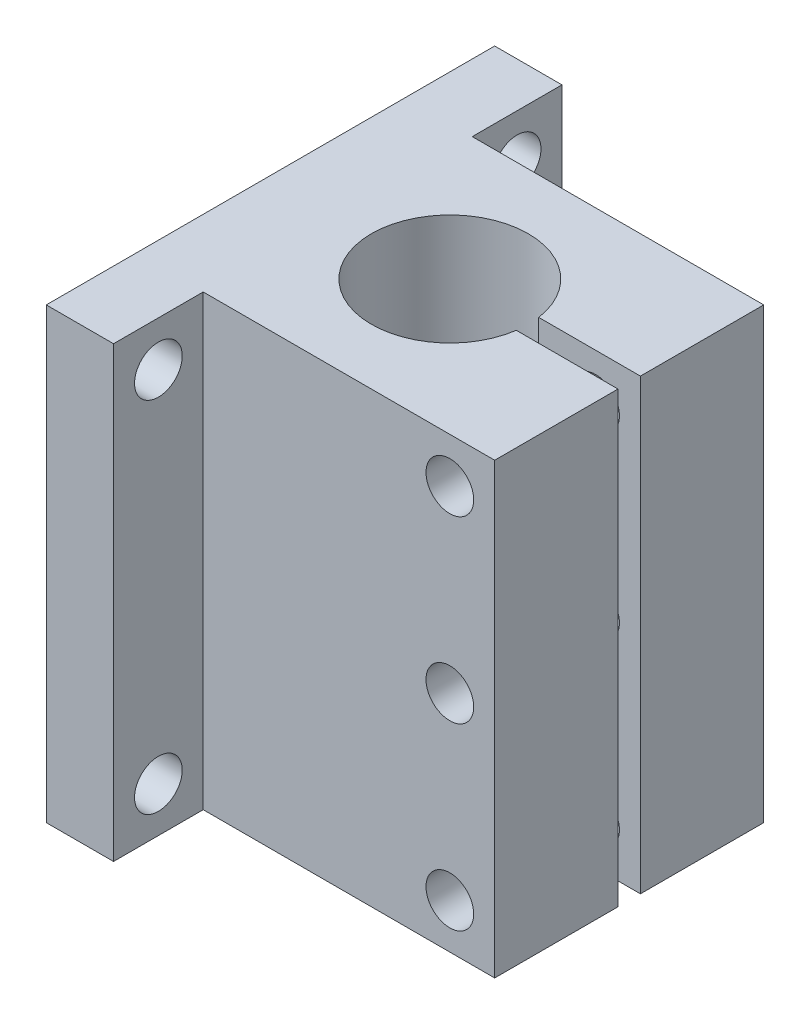
ISO-10303-21;
HEADER;
FILE_DESCRIPTION(('STEP AP214'),'2;1');
FILE_NAME('part.step','',(''),(''),'','','');
FILE_SCHEMA(('AUTOMOTIVE_DESIGN { 1 0 10303 214 1 1 1 1 }'));
ENDSEC;
DATA;
#1=APPLICATION_CONTEXT('core data for automotive mechanical design processes');
#2=APPLICATION_PROTOCOL_DEFINITION('international standard','automotive_design',2000,#1);
#3=PRODUCT_CONTEXT('',#1,'mechanical');
#4=PRODUCT('Part','Part','',(#3));
#5=PRODUCT_RELATED_PRODUCT_CATEGORY('part','',(#4));
#6=PRODUCT_DEFINITION_FORMATION('','',#4);
#7=PRODUCT_DEFINITION_CONTEXT('part definition',#1,'design');
#8=PRODUCT_DEFINITION('design','',#6,#7);
#9=PRODUCT_DEFINITION_SHAPE('','',#8);
#10=(LENGTH_UNIT() NAMED_UNIT(*) SI_UNIT(.MILLI.,.METRE.));
#11=(NAMED_UNIT(*) PLANE_ANGLE_UNIT() SI_UNIT($,.RADIAN.));
#12=(NAMED_UNIT(*) SI_UNIT($,.STERADIAN.) SOLID_ANGLE_UNIT());
#13=UNCERTAINTY_MEASURE_WITH_UNIT(LENGTH_MEASURE(1.E-05),#10,'distance_accuracy_value','');
#14=(GEOMETRIC_REPRESENTATION_CONTEXT(3) GLOBAL_UNCERTAINTY_ASSIGNED_CONTEXT((#13)) GLOBAL_UNIT_ASSIGNED_CONTEXT((#10,
#11,#12)) REPRESENTATION_CONTEXT('',''));
#15=CARTESIAN_POINT('',(0.,0.,0.));
#16=DIRECTION('',(0.,0.,1.));
#17=DIRECTION('',(1.,0.,0.));
#18=AXIS2_PLACEMENT_3D('',#15,#16,#17);
#19=CARTESIAN_POINT('',(25.4,63.5,-31.75));
#20=DIRECTION('',(-1.,0.,0.));
#21=DIRECTION('',(0.,0.,1.));
#22=AXIS2_PLACEMENT_3D('',#19,#20,#21);
#23=PLANE('',#22);
#24=DIRECTION('',(0.,0.,-1.));
#25=VECTOR('',#24,1.);
#26=CARTESIAN_POINT('',(25.4,0.,-31.75));
#27=LINE('',#26,#25);
#28=CARTESIAN_POINT('',(25.4,0.,19.05));
#29=VERTEX_POINT('',#28);
#30=CARTESIAN_POINT('',(25.4,0.,1.5875));
#31=VERTEX_POINT('',#30);
#32=EDGE_CURVE('E139',#29,#31,#27,.T.);
#33=ORIENTED_EDGE('',*,*,#32,.T.);
#34=DIRECTION('',(0.,-1.,0.));
#35=VECTOR('',#34,1.);
#36=CARTESIAN_POINT('',(25.4,0.,1.5875));
#37=LINE('',#36,#35);
#38=CARTESIAN_POINT('',(25.4,63.5,1.5875));
#39=VERTEX_POINT('',#38);
#40=EDGE_CURVE('E123',#39,#31,#37,.T.);
#41=ORIENTED_EDGE('',*,*,#40,.F.);
#42=DIRECTION('',(0.,0.,-1.));
#43=VECTOR('',#42,1.);
#44=CARTESIAN_POINT('',(25.4,63.5,-31.75));
#45=LINE('',#44,#43);
#46=CARTESIAN_POINT('',(25.4,63.5,19.05));
#47=VERTEX_POINT('',#46);
#48=EDGE_CURVE('E266',#47,#39,#45,.T.);
#49=ORIENTED_EDGE('',*,*,#48,.F.);
#50=DIRECTION('',(0.,1.,0.));
#51=VECTOR('',#50,1.);
#52=CARTESIAN_POINT('',(25.4,0.,19.05));
#53=LINE('',#52,#51);
#54=EDGE_CURVE('E146',#29,#47,#53,.T.);
#55=ORIENTED_EDGE('',*,*,#54,.F.);
#56=EDGE_LOOP('',(#33,#41,#49,#55));
#57=FACE_BOUND('',#56,.T.);
#58=ADVANCED_FACE('F35',(#57),#23,.F.);
#59=CARTESIAN_POINT('',(25.4,63.5,-1.5875));
#60=VERTEX_POINT('',#59);
#61=CARTESIAN_POINT('',(25.4,63.5,-19.05));
#62=VERTEX_POINT('',#61);
#63=EDGE_CURVE('E160',#60,#62,#45,.T.);
#64=ORIENTED_EDGE('',*,*,#63,.F.);
#65=DIRECTION('',(0.,1.,0.));
#66=VECTOR('',#65,1.);
#67=CARTESIAN_POINT('',(25.4,0.,-1.5875));
#68=LINE('',#67,#66);
#69=CARTESIAN_POINT('',(25.4,0.,-1.5875));
#70=VERTEX_POINT('',#69);
#71=EDGE_CURVE('E131',#70,#60,#68,.T.);
#72=ORIENTED_EDGE('',*,*,#71,.F.);
#73=CARTESIAN_POINT('',(25.4,0.,-19.05));
#74=VERTEX_POINT('',#73);
#75=EDGE_CURVE('E148',#70,#74,#27,.T.);
#76=ORIENTED_EDGE('',*,*,#75,.T.);
#77=DIRECTION('',(0.,1.,0.));
#78=VECTOR('',#77,1.);
#79=CARTESIAN_POINT('',(25.4,0.,-19.05));
#80=LINE('',#79,#78);
#81=EDGE_CURVE('E256',#74,#62,#80,.T.);
#82=ORIENTED_EDGE('',*,*,#81,.T.);
#83=EDGE_LOOP('',(#64,#72,#76,#82));
#84=FACE_BOUND('',#83,.T.);
#85=ADVANCED_FACE('F37',(#84),#23,.F.);
#86=CARTESIAN_POINT('',(-25.4,63.5,-31.75));
#87=DIRECTION('',(0.,0.,1.));
#88=DIRECTION('',(1.,0.,0.));
#89=AXIS2_PLACEMENT_3D('',#86,#87,#88);
#90=PLANE('',#89);
#91=DIRECTION('',(-1.,0.,0.));
#92=VECTOR('',#91,1.);
#93=CARTESIAN_POINT('',(-25.4,63.5,-31.75));
#94=LINE('',#93,#92);
#95=CARTESIAN_POINT('',(-15.875,63.5,-31.75));
#96=VERTEX_POINT('',#95);
#97=CARTESIAN_POINT('',(-25.4,63.5,-31.75));
#98=VERTEX_POINT('',#97);
#99=EDGE_CURVE('E268',#96,#98,#94,.T.);
#100=ORIENTED_EDGE('',*,*,#99,.F.);
#101=DIRECTION('',(0.,1.,0.));
#102=VECTOR('',#101,1.);
#103=CARTESIAN_POINT('',(-15.875,0.,-31.75));
#104=LINE('',#103,#102);
#105=CARTESIAN_POINT('',(-15.875,0.,-31.75));
#106=VERTEX_POINT('',#105);
#107=EDGE_CURVE('E251',#106,#96,#104,.T.);
#108=ORIENTED_EDGE('',*,*,#107,.F.);
#109=DIRECTION('',(-1.,0.,0.));
#110=VECTOR('',#109,1.);
#111=CARTESIAN_POINT('',(-25.4,0.,-31.75));
#112=LINE('',#111,#110);
#113=CARTESIAN_POINT('',(-25.4,0.,-31.75));
#114=VERTEX_POINT('',#113);
#115=EDGE_CURVE('E147',#106,#114,#112,.T.);
#116=ORIENTED_EDGE('',*,*,#115,.T.);
#117=DIRECTION('',(0.,-1.,0.));
#118=VECTOR('',#117,1.);
#119=CARTESIAN_POINT('',(-25.4,63.5,-31.75));
#120=LINE('',#119,#118);
#121=EDGE_CURVE('E164',#98,#114,#120,.T.);
#122=ORIENTED_EDGE('',*,*,#121,.F.);
#123=EDGE_LOOP('',(#100,#108,#116,#122));
#124=FACE_BOUND('',#123,.T.);
#125=ADVANCED_FACE('F306',(#124),#90,.F.);
#126=CARTESIAN_POINT('',(-25.4,63.5,-31.75));
#127=DIRECTION('',(1.,0.,0.));
#128=DIRECTION('',(0.,0.,-1.));
#129=AXIS2_PLACEMENT_3D('',#126,#127,#128);
#130=PLANE('',#129);
#131=CARTESIAN_POINT('',(-25.4,57.15,25.4));
#132=DIRECTION('',(1.,0.,0.));
#133=DIRECTION('',(0.,0.,-1.));
#134=AXIS2_PLACEMENT_3D('',#131,#132,#133);
#135=CIRCLE('',#134,3.3782);
#136=CARTESIAN_POINT('',(-25.4,57.15,22.0218));
#137=VERTEX_POINT('',#136);
#138=EDGE_CURVE('E172',#137,#137,#135,.T.);
#139=ORIENTED_EDGE('',*,*,#138,.T.);
#140=EDGE_LOOP('',(#139));
#141=FACE_BOUND('',#140,.T.);
#142=CARTESIAN_POINT('',(-25.4,6.35000000000001,-25.4));
#143=DIRECTION('',(1.,0.,0.));
#144=DIRECTION('',(0.,0.,-1.));
#145=AXIS2_PLACEMENT_3D('',#142,#143,#144);
#146=CIRCLE('',#145,3.3782);
#147=CARTESIAN_POINT('',(-25.4,6.35000000000001,-28.7782));
#148=VERTEX_POINT('',#147);
#149=EDGE_CURVE('E217',#148,#148,#146,.T.);
#150=ORIENTED_EDGE('',*,*,#149,.T.);
#151=EDGE_LOOP('',(#150));
#152=FACE_BOUND('',#151,.T.);
#153=CARTESIAN_POINT('',(-25.4,6.35,25.4));
#154=DIRECTION('',(1.,0.,0.));
#155=DIRECTION('',(0.,0.,-1.));
#156=AXIS2_PLACEMENT_3D('',#153,#154,#155);
#157=CIRCLE('',#156,3.3782);
#158=CARTESIAN_POINT('',(-25.4,6.35,22.0218));
#159=VERTEX_POINT('',#158);
#160=EDGE_CURVE('E167',#159,#159,#157,.T.);
#161=ORIENTED_EDGE('',*,*,#160,.T.);
#162=EDGE_LOOP('',(#161));
#163=FACE_BOUND('',#162,.T.);
#164=CARTESIAN_POINT('',(-25.4,57.15,-25.4));
#165=DIRECTION('',(1.,0.,0.));
#166=DIRECTION('',(0.,0.,-1.));
#167=AXIS2_PLACEMENT_3D('',#164,#165,#166);
#168=CIRCLE('',#167,3.3782);
#169=CARTESIAN_POINT('',(-25.4,57.15,-28.7782));
#170=VERTEX_POINT('',#169);
#171=EDGE_CURVE('E224',#170,#170,#168,.T.);
#172=ORIENTED_EDGE('',*,*,#171,.T.);
#173=EDGE_LOOP('',(#172));
#174=FACE_BOUND('',#173,.T.);
#175=DIRECTION('',(0.,0.,1.));
#176=VECTOR('',#175,1.);
#177=CARTESIAN_POINT('',(-25.4,0.,-31.75));
#178=LINE('',#177,#176);
#179=CARTESIAN_POINT('',(-25.4,0.,31.75));
#180=VERTEX_POINT('',#179);
#181=EDGE_CURVE('E150',#114,#180,#178,.T.);
#182=ORIENTED_EDGE('',*,*,#181,.T.);
#183=DIRECTION('',(0.,-1.,0.));
#184=VECTOR('',#183,1.);
#185=CARTESIAN_POINT('',(-25.4,63.5,31.75));
#186=LINE('',#185,#184);
#187=CARTESIAN_POINT('',(-25.4,63.5,31.75));
#188=VERTEX_POINT('',#187);
#189=EDGE_CURVE('E161',#188,#180,#186,.T.);
#190=ORIENTED_EDGE('',*,*,#189,.F.);
#191=DIRECTION('',(0.,0.,1.));
#192=VECTOR('',#191,1.);
#193=CARTESIAN_POINT('',(-25.4,63.5,-31.75));
#194=LINE('',#193,#192);
#195=EDGE_CURVE('E269',#98,#188,#194,.T.);
#196=ORIENTED_EDGE('',*,*,#195,.F.);
#197=ORIENTED_EDGE('',*,*,#121,.T.);
#198=EDGE_LOOP('',(#182,#190,#196,#197));
#199=FACE_BOUND('',#198,.T.);
#200=ADVANCED_FACE('F309',(#141,#152,#163,#174,#199),#130,.F.);
#201=CARTESIAN_POINT('',(-25.4,63.5,31.75));
#202=DIRECTION('',(0.,0.,-1.));
#203=DIRECTION('',(-1.,0.,0.));
#204=AXIS2_PLACEMENT_3D('',#201,#202,#203);
#205=PLANE('',#204);
#206=DIRECTION('',(1.,0.,0.));
#207=VECTOR('',#206,1.);
#208=CARTESIAN_POINT('',(-25.4,0.,31.75));
#209=LINE('',#208,#207);
#210=CARTESIAN_POINT('',(-15.875,0.,31.75));
#211=VERTEX_POINT('',#210);
#212=EDGE_CURVE('E157',#180,#211,#209,.T.);
#213=ORIENTED_EDGE('',*,*,#212,.T.);
#214=DIRECTION('',(0.,1.,0.));
#215=VECTOR('',#214,1.);
#216=CARTESIAN_POINT('',(-15.875,0.,31.75));
#217=LINE('',#216,#215);
#218=CARTESIAN_POINT('',(-15.875,63.5,31.75));
#219=VERTEX_POINT('',#218);
#220=EDGE_CURVE('E234',#211,#219,#217,.T.);
#221=ORIENTED_EDGE('',*,*,#220,.T.);
#222=DIRECTION('',(1.,0.,0.));
#223=VECTOR('',#222,1.);
#224=CARTESIAN_POINT('',(-25.4,63.5,31.75));
#225=LINE('',#224,#223);
#226=EDGE_CURVE('E153',#188,#219,#225,.T.);
#227=ORIENTED_EDGE('',*,*,#226,.F.);
#228=ORIENTED_EDGE('',*,*,#189,.T.);
#229=EDGE_LOOP('',(#213,#221,#227,#228));
#230=FACE_BOUND('',#229,.T.);
#231=ADVANCED_FACE('F279',(#230),#205,.F.);
#232=CARTESIAN_POINT('',(0.,63.5,0.));
#233=DIRECTION('',(0.,1.,0.));
#234=DIRECTION('',(0.,0.,1.));
#235=AXIS2_PLACEMENT_3D('',#232,#233,#234);
#236=PLANE('',#235);
#237=DIRECTION('',(1.,0.,0.));
#238=VECTOR('',#237,1.);
#239=CARTESIAN_POINT('',(1.27000000000002,63.5,1.5875));
#240=LINE('',#239,#238);
#241=CARTESIAN_POINT('',(10.9985226280624,63.5,1.5875));
#242=VERTEX_POINT('',#241);
#243=EDGE_CURVE('E126',#242,#39,#240,.T.);
#244=ORIENTED_EDGE('',*,*,#243,.F.);
#245=CARTESIAN_POINT('',(0.,63.5,0.));
#246=DIRECTION('',(0.,1.,0.));
#247=DIRECTION('',(0.,0.,1.));
#248=AXIS2_PLACEMENT_3D('',#245,#246,#247);
#249=CIRCLE('',#248,11.1125);
#250=CARTESIAN_POINT('',(10.9985226280624,63.5,-1.5875));
#251=VERTEX_POINT('',#250);
#252=EDGE_CURVE('E259',#251,#242,#249,.T.);
#253=ORIENTED_EDGE('',*,*,#252,.F.);
#254=DIRECTION('',(1.,0.,0.));
#255=VECTOR('',#254,1.);
#256=CARTESIAN_POINT('',(1.27000000000002,63.5,-1.5875));
#257=LINE('',#256,#255);
#258=EDGE_CURVE('E52',#251,#60,#257,.T.);
#259=ORIENTED_EDGE('',*,*,#258,.T.);
#260=ORIENTED_EDGE('',*,*,#63,.T.);
#261=DIRECTION('',(1.,0.,0.));
#262=VECTOR('',#261,1.);
#263=CARTESIAN_POINT('',(25.4,63.5,-19.05));
#264=LINE('',#263,#262);
#265=CARTESIAN_POINT('',(-15.875,63.5,-19.05));
#266=VERTEX_POINT('',#265);
#267=EDGE_CURVE('E248',#266,#62,#264,.T.);
#268=ORIENTED_EDGE('',*,*,#267,.F.);
#269=DIRECTION('',(0.,0.,1.));
#270=VECTOR('',#269,1.);
#271=CARTESIAN_POINT('',(-15.875,63.5,-31.75));
#272=LINE('',#271,#270);
#273=EDGE_CURVE('E240',#96,#266,#272,.T.);
#274=ORIENTED_EDGE('',*,*,#273,.F.);
#275=ORIENTED_EDGE('',*,*,#99,.T.);
#276=ORIENTED_EDGE('',*,*,#195,.T.);
#277=ORIENTED_EDGE('',*,*,#226,.T.);
#278=DIRECTION('',(0.,0.,1.));
#279=VECTOR('',#278,1.);
#280=CARTESIAN_POINT('',(-15.875,63.5,31.75));
#281=LINE('',#280,#279);
#282=CARTESIAN_POINT('',(-15.875,63.5,19.05));
#283=VERTEX_POINT('',#282);
#284=EDGE_CURVE('E227',#283,#219,#281,.T.);
#285=ORIENTED_EDGE('',*,*,#284,.F.);
#286=DIRECTION('',(-1.,0.,0.));
#287=VECTOR('',#286,1.);
#288=CARTESIAN_POINT('',(-15.875,63.5,19.05));
#289=LINE('',#288,#287);
#290=EDGE_CURVE('E232',#47,#283,#289,.T.);
#291=ORIENTED_EDGE('',*,*,#290,.F.);
#292=ORIENTED_EDGE('',*,*,#48,.T.);
#293=EDGE_LOOP('',(#244,#253,#259,#260,#268,#274,#275,#276,#277,#285,#291,#292));
#294=FACE_BOUND('',#293,.T.);
#295=ADVANCED_FACE('F276',(#294),#236,.T.);
#296=CARTESIAN_POINT('',(0.,0.,0.));
#297=DIRECTION('',(0.,1.,0.));
#298=DIRECTION('',(0.,0.,1.));
#299=AXIS2_PLACEMENT_3D('',#296,#297,#298);
#300=PLANE('',#299);
#301=CARTESIAN_POINT('',(0.,0.,0.));
#302=DIRECTION('',(0.,1.,0.));
#303=DIRECTION('',(0.,0.,1.));
#304=AXIS2_PLACEMENT_3D('',#301,#302,#303);
#305=CIRCLE('',#304,11.1125);
#306=CARTESIAN_POINT('',(10.9985226280624,0.,-1.5875));
#307=VERTEX_POINT('',#306);
#308=CARTESIAN_POINT('',(10.9985226280624,0.,1.5875));
#309=VERTEX_POINT('',#308);
#310=EDGE_CURVE('E142',#307,#309,#305,.T.);
#311=ORIENTED_EDGE('',*,*,#310,.T.);
#312=DIRECTION('',(1.,0.,0.));
#313=VECTOR('',#312,1.);
#314=CARTESIAN_POINT('',(1.27000000000002,0.,1.5875));
#315=LINE('',#314,#313);
#316=EDGE_CURVE('E60',#309,#31,#315,.T.);
#317=ORIENTED_EDGE('',*,*,#316,.T.);
#318=ORIENTED_EDGE('',*,*,#32,.F.);
#319=DIRECTION('',(-1.,0.,0.));
#320=VECTOR('',#319,1.);
#321=CARTESIAN_POINT('',(-15.875,0.,19.05));
#322=LINE('',#321,#320);
#323=CARTESIAN_POINT('',(-15.875,0.,19.05));
#324=VERTEX_POINT('',#323);
#325=EDGE_CURVE('E231',#29,#324,#322,.T.);
#326=ORIENTED_EDGE('',*,*,#325,.T.);
#327=DIRECTION('',(0.,0.,1.));
#328=VECTOR('',#327,1.);
#329=CARTESIAN_POINT('',(-15.875,0.,31.75));
#330=LINE('',#329,#328);
#331=EDGE_CURVE('E228',#324,#211,#330,.T.);
#332=ORIENTED_EDGE('',*,*,#331,.T.);
#333=ORIENTED_EDGE('',*,*,#212,.F.);
#334=ORIENTED_EDGE('',*,*,#181,.F.);
#335=ORIENTED_EDGE('',*,*,#115,.F.);
#336=DIRECTION('',(0.,0.,1.));
#337=VECTOR('',#336,1.);
#338=CARTESIAN_POINT('',(-15.875,0.,-31.75));
#339=LINE('',#338,#337);
#340=CARTESIAN_POINT('',(-15.875,0.,-19.05));
#341=VERTEX_POINT('',#340);
#342=EDGE_CURVE('E244',#106,#341,#339,.T.);
#343=ORIENTED_EDGE('',*,*,#342,.T.);
#344=DIRECTION('',(1.,0.,0.));
#345=VECTOR('',#344,1.);
#346=CARTESIAN_POINT('',(25.4,0.,-19.05));
#347=LINE('',#346,#345);
#348=EDGE_CURVE('E247',#341,#74,#347,.T.);
#349=ORIENTED_EDGE('',*,*,#348,.T.);
#350=ORIENTED_EDGE('',*,*,#75,.F.);
#351=DIRECTION('',(1.,0.,0.));
#352=VECTOR('',#351,1.);
#353=CARTESIAN_POINT('',(1.27000000000002,0.,-1.5875));
#354=LINE('',#353,#352);
#355=EDGE_CURVE('E143',#307,#70,#354,.T.);
#356=ORIENTED_EDGE('',*,*,#355,.F.);
#357=EDGE_LOOP('',(#311,#317,#318,#326,#332,#333,#334,#335,#343,#349,#350,#356));
#358=FACE_BOUND('',#357,.T.);
#359=ADVANCED_FACE('F137',(#358),#300,.F.);
#360=CARTESIAN_POINT('',(0.,0.,0.));
#361=DIRECTION('',(0.,1.,0.));
#362=DIRECTION('',(0.,0.,1.));
#363=AXIS2_PLACEMENT_3D('',#360,#361,#362);
#364=CYLINDRICAL_SURFACE('',#363,11.1125);
#365=ORIENTED_EDGE('',*,*,#252,.T.);
#366=DIRECTION('',(0.,1.,0.));
#367=VECTOR('',#366,1.);
#368=CARTESIAN_POINT('',(10.9985226280624,0.,1.5875));
#369=LINE('',#368,#367);
#370=EDGE_CURVE('E11',#242,#309,#369,.F.);
#371=ORIENTED_EDGE('',*,*,#370,.T.);
#372=ORIENTED_EDGE('',*,*,#310,.F.);
#373=DIRECTION('',(0.,1.,0.));
#374=VECTOR('',#373,1.);
#375=CARTESIAN_POINT('',(10.9985226280624,0.,-1.5875));
#376=LINE('',#375,#374);
#377=EDGE_CURVE('E44',#307,#251,#376,.T.);
#378=ORIENTED_EDGE('',*,*,#377,.T.);
#379=EDGE_LOOP('',(#365,#371,#372,#378));
#380=FACE_BOUND('',#379,.T.);
#381=ADVANCED_FACE('F289',(#380),#364,.F.);
#382=CARTESIAN_POINT('',(25.4,0.,-19.05));
#383=DIRECTION('',(0.,0.,1.));
#384=DIRECTION('',(1.,0.,0.));
#385=AXIS2_PLACEMENT_3D('',#382,#383,#384);
#386=PLANE('',#385);
#387=CARTESIAN_POINT('',(19.05,57.15,-19.05));
#388=DIRECTION('',(0.,0.,1.));
#389=DIRECTION('',(1.,0.,0.));
#390=AXIS2_PLACEMENT_3D('',#387,#388,#389);
#391=CIRCLE('',#390,3.37819999999999);
#392=CARTESIAN_POINT('',(22.4282,57.15,-19.05));
#393=VERTEX_POINT('',#392);
#394=EDGE_CURVE('E192',#393,#393,#391,.T.);
#395=ORIENTED_EDGE('',*,*,#394,.T.);
#396=EDGE_LOOP('',(#395));
#397=FACE_BOUND('',#396,.T.);
#398=CARTESIAN_POINT('',(19.05,31.75,-19.05));
#399=DIRECTION('',(0.,0.,1.));
#400=DIRECTION('',(1.,0.,0.));
#401=AXIS2_PLACEMENT_3D('',#398,#399,#400);
#402=CIRCLE('',#401,3.37819999999999);
#403=CARTESIAN_POINT('',(22.4282,31.75,-19.05));
#404=VERTEX_POINT('',#403);
#405=EDGE_CURVE('E189',#404,#404,#402,.T.);
#406=ORIENTED_EDGE('',*,*,#405,.T.);
#407=EDGE_LOOP('',(#406));
#408=FACE_BOUND('',#407,.T.);
#409=CARTESIAN_POINT('',(19.05,6.35,-19.05));
#410=DIRECTION('',(0.,0.,1.));
#411=DIRECTION('',(1.,0.,0.));
#412=AXIS2_PLACEMENT_3D('',#409,#410,#411);
#413=CIRCLE('',#412,3.37819999999999);
#414=CARTESIAN_POINT('',(22.4282,6.35,-19.05));
#415=VERTEX_POINT('',#414);
#416=EDGE_CURVE('E132',#415,#415,#413,.T.);
#417=ORIENTED_EDGE('',*,*,#416,.T.);
#418=EDGE_LOOP('',(#417));
#419=FACE_BOUND('',#418,.T.);
#420=ORIENTED_EDGE('',*,*,#267,.T.);
#421=ORIENTED_EDGE('',*,*,#81,.F.);
#422=ORIENTED_EDGE('',*,*,#348,.F.);
#423=DIRECTION('',(0.,1.,0.));
#424=VECTOR('',#423,1.);
#425=CARTESIAN_POINT('',(-15.875,0.,-19.05));
#426=LINE('',#425,#424);
#427=EDGE_CURVE('E260',#341,#266,#426,.T.);
#428=ORIENTED_EDGE('',*,*,#427,.T.);
#429=EDGE_LOOP('',(#420,#421,#422,#428));
#430=FACE_BOUND('',#429,.T.);
#431=ADVANCED_FACE('F297',(#397,#408,#419,#430),#386,.F.);
#432=CARTESIAN_POINT('',(-15.875,0.,-31.75));
#433=DIRECTION('',(-1.,0.,0.));
#434=DIRECTION('',(0.,0.,1.));
#435=AXIS2_PLACEMENT_3D('',#432,#433,#434);
#436=PLANE('',#435);
#437=CARTESIAN_POINT('',(-15.875,6.35000000000001,-25.4));
#438=DIRECTION('',(1.,0.,0.));
#439=DIRECTION('',(0.,0.,-1.));
#440=AXIS2_PLACEMENT_3D('',#437,#438,#439);
#441=CIRCLE('',#440,3.3782);
#442=CARTESIAN_POINT('',(-15.875,6.35000000000001,-28.7782));
#443=VERTEX_POINT('',#442);
#444=EDGE_CURVE('E175',#443,#443,#441,.T.);
#445=ORIENTED_EDGE('',*,*,#444,.F.);
#446=EDGE_LOOP('',(#445));
#447=FACE_BOUND('',#446,.T.);
#448=CARTESIAN_POINT('',(-15.875,57.15,-25.4));
#449=DIRECTION('',(1.,0.,0.));
#450=DIRECTION('',(0.,0.,-1.));
#451=AXIS2_PLACEMENT_3D('',#448,#449,#450);
#452=CIRCLE('',#451,3.3782);
#453=CARTESIAN_POINT('',(-15.875,57.15,-28.7782));
#454=VERTEX_POINT('',#453);
#455=EDGE_CURVE('E170',#454,#454,#452,.T.);
#456=ORIENTED_EDGE('',*,*,#455,.F.);
#457=EDGE_LOOP('',(#456));
#458=FACE_BOUND('',#457,.T.);
#459=ORIENTED_EDGE('',*,*,#273,.T.);
#460=ORIENTED_EDGE('',*,*,#427,.F.);
#461=ORIENTED_EDGE('',*,*,#342,.F.);
#462=ORIENTED_EDGE('',*,*,#107,.T.);
#463=EDGE_LOOP('',(#459,#460,#461,#462));
#464=FACE_BOUND('',#463,.T.);
#465=ADVANCED_FACE('F310',(#447,#458,#464),#436,.F.);
#466=CARTESIAN_POINT('',(-15.875,0.,31.75));
#467=DIRECTION('',(-1.,0.,0.));
#468=DIRECTION('',(0.,0.,1.));
#469=AXIS2_PLACEMENT_3D('',#466,#467,#468);
#470=PLANE('',#469);
#471=CARTESIAN_POINT('',(-15.875,57.15,25.4));
#472=DIRECTION('',(1.,0.,0.));
#473=DIRECTION('',(0.,0.,-1.));
#474=AXIS2_PLACEMENT_3D('',#471,#472,#473);
#475=CIRCLE('',#474,3.3782);
#476=CARTESIAN_POINT('',(-15.875,57.15,22.0218));
#477=VERTEX_POINT('',#476);
#478=EDGE_CURVE('E176',#477,#477,#475,.T.);
#479=ORIENTED_EDGE('',*,*,#478,.F.);
#480=EDGE_LOOP('',(#479));
#481=FACE_BOUND('',#480,.T.);
#482=CARTESIAN_POINT('',(-15.875,6.35,25.4));
#483=DIRECTION('',(1.,0.,0.));
#484=DIRECTION('',(0.,0.,-1.));
#485=AXIS2_PLACEMENT_3D('',#482,#483,#484);
#486=CIRCLE('',#485,3.3782);
#487=CARTESIAN_POINT('',(-15.875,6.35,22.0218));
#488=VERTEX_POINT('',#487);
#489=EDGE_CURVE('E171',#488,#488,#486,.T.);
#490=ORIENTED_EDGE('',*,*,#489,.F.);
#491=EDGE_LOOP('',(#490));
#492=FACE_BOUND('',#491,.T.);
#493=ORIENTED_EDGE('',*,*,#284,.T.);
#494=ORIENTED_EDGE('',*,*,#220,.F.);
#495=ORIENTED_EDGE('',*,*,#331,.F.);
#496=DIRECTION('',(0.,1.,0.));
#497=VECTOR('',#496,1.);
#498=CARTESIAN_POINT('',(-15.875,0.,19.05));
#499=LINE('',#498,#497);
#500=EDGE_CURVE('E238',#324,#283,#499,.T.);
#501=ORIENTED_EDGE('',*,*,#500,.T.);
#502=EDGE_LOOP('',(#493,#494,#495,#501));
#503=FACE_BOUND('',#502,.T.);
#504=ADVANCED_FACE('F282',(#481,#492,#503),#470,.F.);
#505=CARTESIAN_POINT('',(-15.875,0.,19.05));
#506=DIRECTION('',(0.,0.,-1.));
#507=DIRECTION('',(-1.,0.,0.));
#508=AXIS2_PLACEMENT_3D('',#505,#506,#507);
#509=PLANE('',#508);
#510=CARTESIAN_POINT('',(19.05,57.15,19.05));
#511=DIRECTION('',(0.,0.,1.));
#512=DIRECTION('',(1.,0.,0.));
#513=AXIS2_PLACEMENT_3D('',#510,#511,#512);
#514=CIRCLE('',#513,3.37819999999999);
#515=CARTESIAN_POINT('',(22.4282,57.15,19.05));
#516=VERTEX_POINT('',#515);
#517=EDGE_CURVE('E551',#516,#516,#514,.T.);
#518=ORIENTED_EDGE('',*,*,#517,.F.);
#519=EDGE_LOOP('',(#518));
#520=FACE_BOUND('',#519,.T.);
#521=CARTESIAN_POINT('',(19.05,31.75,19.05));
#522=DIRECTION('',(0.,0.,1.));
#523=DIRECTION('',(1.,0.,0.));
#524=AXIS2_PLACEMENT_3D('',#521,#522,#523);
#525=CIRCLE('',#524,3.37819999999999);
#526=CARTESIAN_POINT('',(22.4282,31.75,19.05));
#527=VERTEX_POINT('',#526);
#528=EDGE_CURVE('E185',#527,#527,#525,.T.);
#529=ORIENTED_EDGE('',*,*,#528,.F.);
#530=EDGE_LOOP('',(#529));
#531=FACE_BOUND('',#530,.T.);
#532=CARTESIAN_POINT('',(19.05,6.35,19.05));
#533=DIRECTION('',(0.,0.,1.));
#534=DIRECTION('',(1.,0.,0.));
#535=AXIS2_PLACEMENT_3D('',#532,#533,#534);
#536=CIRCLE('',#535,3.37819999999999);
#537=CARTESIAN_POINT('',(22.4282,6.35,19.05));
#538=VERTEX_POINT('',#537);
#539=EDGE_CURVE('E181',#538,#538,#536,.T.);
#540=ORIENTED_EDGE('',*,*,#539,.F.);
#541=EDGE_LOOP('',(#540));
#542=FACE_BOUND('',#541,.T.);
#543=ORIENTED_EDGE('',*,*,#290,.T.);
#544=ORIENTED_EDGE('',*,*,#500,.F.);
#545=ORIENTED_EDGE('',*,*,#325,.F.);
#546=ORIENTED_EDGE('',*,*,#54,.T.);
#547=EDGE_LOOP('',(#543,#544,#545,#546));
#548=FACE_BOUND('',#547,.T.);
#549=ADVANCED_FACE('F286',(#520,#531,#542,#548),#509,.F.);
#550=CARTESIAN_POINT('',(-15.875,57.15,-25.4));
#551=DIRECTION('',(1.,0.,0.));
#552=DIRECTION('',(0.,0.,-1.));
#553=AXIS2_PLACEMENT_3D('',#550,#551,#552);
#554=CYLINDRICAL_SURFACE('',#553,3.3782);
#555=ORIENTED_EDGE('',*,*,#455,.T.);
#556=EDGE_LOOP('',(#555));
#557=FACE_BOUND('',#556,.T.);
#558=ORIENTED_EDGE('',*,*,#171,.F.);
#559=EDGE_LOOP('',(#558));
#560=FACE_BOUND('',#559,.T.);
#561=ADVANCED_FACE('F361',(#557,#560),#554,.F.);
#562=CARTESIAN_POINT('',(-15.875,6.35,25.4));
#563=DIRECTION('',(1.,0.,0.));
#564=DIRECTION('',(0.,0.,-1.));
#565=AXIS2_PLACEMENT_3D('',#562,#563,#564);
#566=CYLINDRICAL_SURFACE('',#565,3.3782);
#567=ORIENTED_EDGE('',*,*,#489,.T.);
#568=EDGE_LOOP('',(#567));
#569=FACE_BOUND('',#568,.T.);
#570=ORIENTED_EDGE('',*,*,#160,.F.);
#571=EDGE_LOOP('',(#570));
#572=FACE_BOUND('',#571,.T.);
#573=ADVANCED_FACE('F446',(#569,#572),#566,.F.);
#574=CARTESIAN_POINT('',(-15.875,6.35000000000001,-25.4));
#575=DIRECTION('',(1.,0.,0.));
#576=DIRECTION('',(0.,0.,-1.));
#577=AXIS2_PLACEMENT_3D('',#574,#575,#576);
#578=CYLINDRICAL_SURFACE('',#577,3.3782);
#579=ORIENTED_EDGE('',*,*,#444,.T.);
#580=EDGE_LOOP('',(#579));
#581=FACE_BOUND('',#580,.T.);
#582=ORIENTED_EDGE('',*,*,#149,.F.);
#583=EDGE_LOOP('',(#582));
#584=FACE_BOUND('',#583,.T.);
#585=ADVANCED_FACE('F442',(#581,#584),#578,.F.);
#586=CARTESIAN_POINT('',(-15.875,57.15,25.4));
#587=DIRECTION('',(1.,0.,0.));
#588=DIRECTION('',(0.,0.,-1.));
#589=AXIS2_PLACEMENT_3D('',#586,#587,#588);
#590=CYLINDRICAL_SURFACE('',#589,3.3782);
#591=ORIENTED_EDGE('',*,*,#478,.T.);
#592=EDGE_LOOP('',(#591));
#593=FACE_BOUND('',#592,.T.);
#594=ORIENTED_EDGE('',*,*,#138,.F.);
#595=EDGE_LOOP('',(#594));
#596=FACE_BOUND('',#595,.T.);
#597=ADVANCED_FACE('F370',(#593,#596),#590,.F.);
#598=CARTESIAN_POINT('',(1.27000000000002,0.,-1.5875));
#599=DIRECTION('',(0.,0.,-1.));
#600=DIRECTION('',(-1.,0.,0.));
#601=AXIS2_PLACEMENT_3D('',#598,#599,#600);
#602=PLANE('',#601);
#603=CARTESIAN_POINT('',(19.05,57.15,-1.5875));
#604=DIRECTION('',(0.,0.,-1.));
#605=DIRECTION('',(-1.,0.,0.));
#606=AXIS2_PLACEMENT_3D('',#603,#604,#605);
#607=CIRCLE('',#606,3.37819999999999);
#608=CARTESIAN_POINT('',(15.6718,57.15,-1.5875));
#609=VERTEX_POINT('',#608);
#610=EDGE_CURVE('E197',#609,#609,#607,.T.);
#611=ORIENTED_EDGE('',*,*,#610,.T.);
#612=EDGE_LOOP('',(#611));
#613=FACE_BOUND('',#612,.T.);
#614=CARTESIAN_POINT('',(19.05,31.75,-1.5875));
#615=DIRECTION('',(0.,0.,-1.));
#616=DIRECTION('',(-1.,0.,0.));
#617=AXIS2_PLACEMENT_3D('',#614,#615,#616);
#618=CIRCLE('',#617,3.37819999999999);
#619=CARTESIAN_POINT('',(15.6718,31.75,-1.5875));
#620=VERTEX_POINT('',#619);
#621=EDGE_CURVE('E184',#620,#620,#618,.T.);
#622=ORIENTED_EDGE('',*,*,#621,.T.);
#623=EDGE_LOOP('',(#622));
#624=FACE_BOUND('',#623,.T.);
#625=CARTESIAN_POINT('',(19.05,6.35,-1.5875));
#626=DIRECTION('',(0.,0.,-1.));
#627=DIRECTION('',(-1.,0.,0.));
#628=AXIS2_PLACEMENT_3D('',#625,#626,#627);
#629=CIRCLE('',#628,3.37819999999999);
#630=CARTESIAN_POINT('',(15.6718,6.35,-1.5875));
#631=VERTEX_POINT('',#630);
#632=EDGE_CURVE('E180',#631,#631,#629,.T.);
#633=ORIENTED_EDGE('',*,*,#632,.T.);
#634=EDGE_LOOP('',(#633));
#635=FACE_BOUND('',#634,.T.);
#636=ORIENTED_EDGE('',*,*,#355,.T.);
#637=ORIENTED_EDGE('',*,*,#71,.T.);
#638=ORIENTED_EDGE('',*,*,#258,.F.);
#639=ORIENTED_EDGE('',*,*,#377,.F.);
#640=EDGE_LOOP('',(#636,#637,#638,#639));
#641=FACE_BOUND('',#640,.T.);
#642=ADVANCED_FACE('F290',(#613,#624,#635,#641),#602,.F.);
#643=CARTESIAN_POINT('',(1.27000000000002,0.,1.5875));
#644=DIRECTION('',(0.,0.,1.));
#645=DIRECTION('',(1.,0.,0.));
#646=AXIS2_PLACEMENT_3D('',#643,#644,#645);
#647=PLANE('',#646);
#648=CARTESIAN_POINT('',(19.05,57.15,1.5875));
#649=DIRECTION('',(0.,0.,1.));
#650=DIRECTION('',(1.,0.,0.));
#651=AXIS2_PLACEMENT_3D('',#648,#649,#650);
#652=CIRCLE('',#651,3.37819999999999);
#653=CARTESIAN_POINT('',(22.4282,57.15,1.5875));
#654=VERTEX_POINT('',#653);
#655=EDGE_CURVE('E39',#654,#654,#652,.T.);
#656=ORIENTED_EDGE('',*,*,#655,.T.);
#657=EDGE_LOOP('',(#656));
#658=FACE_BOUND('',#657,.T.);
#659=CARTESIAN_POINT('',(19.05,31.75,1.5875));
#660=DIRECTION('',(0.,0.,1.));
#661=DIRECTION('',(1.,0.,0.));
#662=AXIS2_PLACEMENT_3D('',#659,#660,#661);
#663=CIRCLE('',#662,3.37819999999999);
#664=CARTESIAN_POINT('',(22.4282,31.75,1.5875));
#665=VERTEX_POINT('',#664);
#666=EDGE_CURVE('E182',#665,#665,#663,.T.);
#667=ORIENTED_EDGE('',*,*,#666,.T.);
#668=EDGE_LOOP('',(#667));
#669=FACE_BOUND('',#668,.T.);
#670=CARTESIAN_POINT('',(19.05,6.35,1.5875));
#671=DIRECTION('',(0.,0.,1.));
#672=DIRECTION('',(1.,0.,0.));
#673=AXIS2_PLACEMENT_3D('',#670,#671,#672);
#674=CIRCLE('',#673,3.37819999999999);
#675=CARTESIAN_POINT('',(22.4282,6.35,1.58749999999999));
#676=VERTEX_POINT('',#675);
#677=EDGE_CURVE('E178',#676,#676,#674,.T.);
#678=ORIENTED_EDGE('',*,*,#677,.T.);
#679=EDGE_LOOP('',(#678));
#680=FACE_BOUND('',#679,.T.);
#681=ORIENTED_EDGE('',*,*,#243,.T.);
#682=ORIENTED_EDGE('',*,*,#40,.T.);
#683=ORIENTED_EDGE('',*,*,#316,.F.);
#684=ORIENTED_EDGE('',*,*,#370,.F.);
#685=EDGE_LOOP('',(#681,#682,#683,#684));
#686=FACE_BOUND('',#685,.T.);
#687=ADVANCED_FACE('F124',(#658,#669,#680,#686),#647,.F.);
#688=CARTESIAN_POINT('',(19.05,6.35,19.05));
#689=DIRECTION('',(0.,0.,1.));
#690=DIRECTION('',(1.,0.,0.));
#691=AXIS2_PLACEMENT_3D('',#688,#689,#690);
#692=CYLINDRICAL_SURFACE('',#691,3.37819999999999);
#693=ORIENTED_EDGE('',*,*,#539,.T.);
#694=EDGE_LOOP('',(#693));
#695=FACE_BOUND('',#694,.T.);
#696=ORIENTED_EDGE('',*,*,#677,.F.);
#697=EDGE_LOOP('',(#696));
#698=FACE_BOUND('',#697,.T.);
#699=ADVANCED_FACE('F379',(#695,#698),#692,.F.);
#700=ORIENTED_EDGE('',*,*,#632,.F.);
#701=EDGE_LOOP('',(#700));
#702=FACE_BOUND('',#701,.T.);
#703=ORIENTED_EDGE('',*,*,#416,.F.);
#704=EDGE_LOOP('',(#703));
#705=FACE_BOUND('',#704,.T.);
#706=ADVANCED_FACE('F388',(#702,#705),#692,.F.);
#707=CARTESIAN_POINT('',(19.05,31.75,19.05));
#708=DIRECTION('',(0.,0.,1.));
#709=DIRECTION('',(1.,0.,0.));
#710=AXIS2_PLACEMENT_3D('',#707,#708,#709);
#711=CYLINDRICAL_SURFACE('',#710,3.37819999999999);
#712=ORIENTED_EDGE('',*,*,#528,.T.);
#713=EDGE_LOOP('',(#712));
#714=FACE_BOUND('',#713,.T.);
#715=ORIENTED_EDGE('',*,*,#666,.F.);
#716=EDGE_LOOP('',(#715));
#717=FACE_BOUND('',#716,.T.);
#718=ADVANCED_FACE('F398',(#714,#717),#711,.F.);
#719=ORIENTED_EDGE('',*,*,#621,.F.);
#720=EDGE_LOOP('',(#719));
#721=FACE_BOUND('',#720,.T.);
#722=ORIENTED_EDGE('',*,*,#405,.F.);
#723=EDGE_LOOP('',(#722));
#724=FACE_BOUND('',#723,.T.);
#725=ADVANCED_FACE('F407',(#721,#724),#711,.F.);
#726=CARTESIAN_POINT('',(19.05,57.15,19.05));
#727=DIRECTION('',(0.,0.,1.));
#728=DIRECTION('',(1.,0.,0.));
#729=AXIS2_PLACEMENT_3D('',#726,#727,#728);
#730=CYLINDRICAL_SURFACE('',#729,3.37819999999999);
#731=ORIENTED_EDGE('',*,*,#517,.T.);
#732=EDGE_LOOP('',(#731));
#733=FACE_BOUND('',#732,.T.);
#734=ORIENTED_EDGE('',*,*,#655,.F.);
#735=EDGE_LOOP('',(#734));
#736=FACE_BOUND('',#735,.T.);
#737=ADVANCED_FACE('F416',(#733,#736),#730,.F.);
#738=ORIENTED_EDGE('',*,*,#610,.F.);
#739=EDGE_LOOP('',(#738));
#740=FACE_BOUND('',#739,.T.);
#741=ORIENTED_EDGE('',*,*,#394,.F.);
#742=EDGE_LOOP('',(#741));
#743=FACE_BOUND('',#742,.T.);
#744=ADVANCED_FACE('F425',(#740,#743),#730,.F.);
#745=CLOSED_SHELL('',(#58,#85,#125,#200,#231,#295,#359,#381,#431,#465,#504,#549,#561,#573,#585,
#597,#642,#687,#699,#706,#718,#725,#737,#744));
#746=MANIFOLD_SOLID_BREP('B2',#745);
#747=ADVANCED_BREP_SHAPE_REPRESENTATION('',(#18,#746),#14);
#748=SHAPE_DEFINITION_REPRESENTATION(#9,#747);
ENDSEC;
END-ISO-10303-21;
